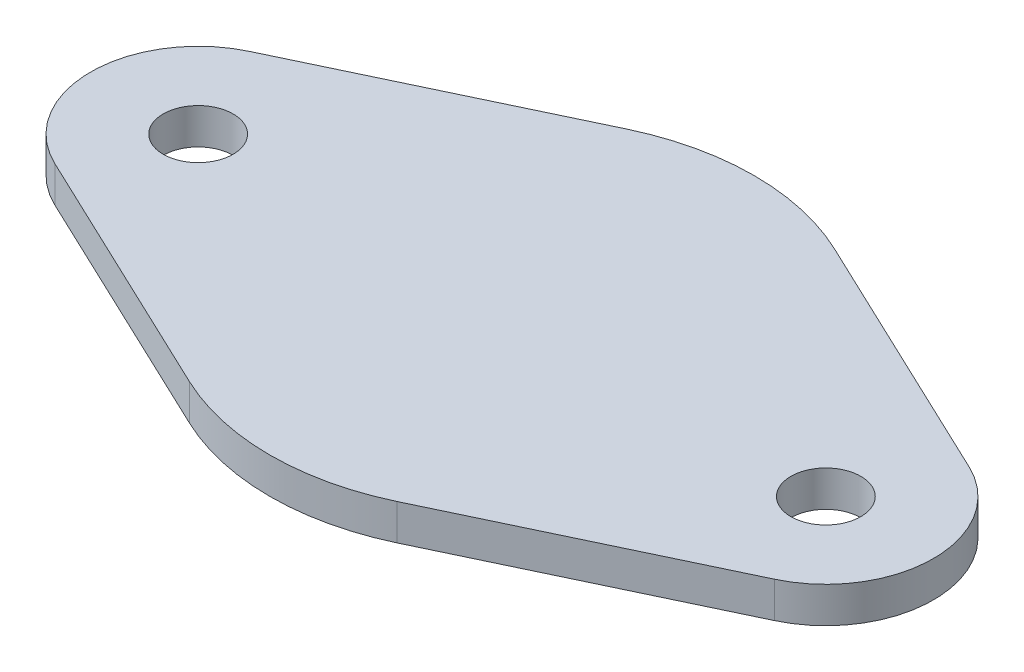
ISO-10303-21;
HEADER;
FILE_DESCRIPTION(('STEP AP214'),'2;1');
FILE_NAME('part.step','',(''),(''),'','','');
FILE_SCHEMA(('AUTOMOTIVE_DESIGN { 1 0 10303 214 1 1 1 1 }'));
ENDSEC;
DATA;
#1=APPLICATION_CONTEXT('core data for automotive mechanical design processes');
#2=APPLICATION_PROTOCOL_DEFINITION('international standard','automotive_design',2000,#1);
#3=PRODUCT_CONTEXT('',#1,'mechanical');
#4=PRODUCT('Part','Part','',(#3));
#5=PRODUCT_RELATED_PRODUCT_CATEGORY('part','',(#4));
#6=PRODUCT_DEFINITION_FORMATION('','',#4);
#7=PRODUCT_DEFINITION_CONTEXT('part definition',#1,'design');
#8=PRODUCT_DEFINITION('design','',#6,#7);
#9=PRODUCT_DEFINITION_SHAPE('','',#8);
#10=(LENGTH_UNIT() NAMED_UNIT(*) SI_UNIT(.MILLI.,.METRE.));
#11=(NAMED_UNIT(*) PLANE_ANGLE_UNIT() SI_UNIT($,.RADIAN.));
#12=(NAMED_UNIT(*) SI_UNIT($,.STERADIAN.) SOLID_ANGLE_UNIT());
#13=UNCERTAINTY_MEASURE_WITH_UNIT(LENGTH_MEASURE(1.E-05),#10,'distance_accuracy_value','');
#14=(GEOMETRIC_REPRESENTATION_CONTEXT(3) GLOBAL_UNCERTAINTY_ASSIGNED_CONTEXT((#13)) GLOBAL_UNIT_ASSIGNED_CONTEXT((#10,
#11,#12)) REPRESENTATION_CONTEXT('',''));
#15=CARTESIAN_POINT('',(0.,0.,0.));
#16=DIRECTION('',(0.,0.,1.));
#17=DIRECTION('',(1.,0.,0.));
#18=AXIS2_PLACEMENT_3D('',#15,#16,#17);
#19=CARTESIAN_POINT('',(-5.78571428571428,2.,12.1973566892209));
#20=DIRECTION('',(0.428571428571428,0.,-0.903507902905251));
#21=DIRECTION('',(-0.903507902905251,0.,-0.428571428571428));
#22=AXIS2_PLACEMENT_3D('',#19,#20,#21);
#23=PLANE('',#22);
#24=DIRECTION('',(0.903507902905251,0.,0.428571428571428));
#25=VECTOR('',#24,1.);
#26=CARTESIAN_POINT('',(-5.78571428571428,0.,12.1973566892209));
#27=LINE('',#26,#25);
#28=CARTESIAN_POINT('',(-20.0714285714286,0.,5.42104741743151));
#29=VERTEX_POINT('',#28);
#30=CARTESIAN_POINT('',(-5.78571428571428,0.,12.1973566892209));
#31=VERTEX_POINT('',#30);
#32=EDGE_CURVE('E146',#29,#31,#27,.T.);
#33=ORIENTED_EDGE('',*,*,#32,.T.);
#34=DIRECTION('',(0.,-1.,0.));
#35=VECTOR('',#34,1.);
#36=CARTESIAN_POINT('',(-5.78571428571428,2.,12.1973566892209));
#37=LINE('',#36,#35);
#38=CARTESIAN_POINT('',(-5.78571428571428,2.,12.1973566892209));
#39=VERTEX_POINT('',#38);
#40=EDGE_CURVE('E11',#39,#31,#37,.T.);
#41=ORIENTED_EDGE('',*,*,#40,.F.);
#42=DIRECTION('',(0.903507902905251,0.,0.428571428571428));
#43=VECTOR('',#42,1.);
#44=CARTESIAN_POINT('',(-5.78571428571428,2.,12.1973566892209));
#45=LINE('',#44,#43);
#46=CARTESIAN_POINT('',(-20.0714285714286,2.,5.42104741743151));
#47=VERTEX_POINT('',#46);
#48=EDGE_CURVE('E190',#47,#39,#45,.T.);
#49=ORIENTED_EDGE('',*,*,#48,.F.);
#50=DIRECTION('',(0.,-1.,0.));
#51=VECTOR('',#50,1.);
#52=CARTESIAN_POINT('',(-20.0714285714286,2.,5.42104741743151));
#53=LINE('',#52,#51);
#54=EDGE_CURVE('E136',#47,#29,#53,.T.);
#55=ORIENTED_EDGE('',*,*,#54,.T.);
#56=EDGE_LOOP('',(#33,#41,#49,#55));
#57=FACE_BOUND('',#56,.T.);
#58=ADVANCED_FACE('F43',(#57),#23,.F.);
#59=CARTESIAN_POINT('',(0.,2.,0.));
#60=DIRECTION('',(0.,-1.,0.));
#61=DIRECTION('',(0.,0.,-1.));
#62=AXIS2_PLACEMENT_3D('',#59,#60,#61);
#63=CYLINDRICAL_SURFACE('',#62,13.5);
#64=CARTESIAN_POINT('',(0.,0.,0.));
#65=DIRECTION('',(0.,1.,0.));
#66=DIRECTION('',(0.,0.,1.));
#67=AXIS2_PLACEMENT_3D('',#64,#65,#66);
#68=CIRCLE('',#67,13.5);
#69=CARTESIAN_POINT('',(5.78571428571428,0.,12.1973566892209));
#70=VERTEX_POINT('',#69);
#71=EDGE_CURVE('E149',#31,#70,#68,.T.);
#72=ORIENTED_EDGE('',*,*,#71,.T.);
#73=DIRECTION('',(0.,-1.,0.));
#74=VECTOR('',#73,1.);
#75=CARTESIAN_POINT('',(5.78571428571428,2.,12.1973566892209));
#76=LINE('',#75,#74);
#77=CARTESIAN_POINT('',(5.78571428571428,2.,12.1973566892209));
#78=VERTEX_POINT('',#77);
#79=EDGE_CURVE('E52',#78,#70,#76,.T.);
#80=ORIENTED_EDGE('',*,*,#79,.F.);
#81=CARTESIAN_POINT('',(0.,2.,0.));
#82=DIRECTION('',(0.,1.,0.));
#83=DIRECTION('',(0.,0.,1.));
#84=AXIS2_PLACEMENT_3D('',#81,#82,#83);
#85=CIRCLE('',#84,13.5);
#86=EDGE_CURVE('E99',#39,#78,#85,.T.);
#87=ORIENTED_EDGE('',*,*,#86,.F.);
#88=ORIENTED_EDGE('',*,*,#40,.T.);
#89=EDGE_LOOP('',(#72,#80,#87,#88));
#90=FACE_BOUND('',#89,.T.);
#91=ADVANCED_FACE('F177',(#90),#63,.T.);
#92=CARTESIAN_POINT('',(5.78571428571427,2.,12.1973566892209));
#93=DIRECTION('',(0.428571428571428,0.,0.903507902905252));
#94=DIRECTION('',(0.903507902905252,0.,-0.428571428571428));
#95=AXIS2_PLACEMENT_3D('',#92,#93,#94);
#96=PLANE('',#95);
#97=DIRECTION('',(-0.903507902905252,0.,0.428571428571428));
#98=VECTOR('',#97,1.);
#99=CARTESIAN_POINT('',(5.78571428571427,0.,12.1973566892209));
#100=LINE('',#99,#98);
#101=CARTESIAN_POINT('',(20.0714285714286,0.,5.42104741743151));
#102=VERTEX_POINT('',#101);
#103=EDGE_CURVE('E152',#102,#70,#100,.T.);
#104=ORIENTED_EDGE('',*,*,#103,.F.);
#105=DIRECTION('',(0.,-1.,0.));
#106=VECTOR('',#105,1.);
#107=CARTESIAN_POINT('',(20.0714285714286,2.,5.42104741743151));
#108=LINE('',#107,#106);
#109=CARTESIAN_POINT('',(20.0714285714286,2.,5.42104741743151));
#110=VERTEX_POINT('',#109);
#111=EDGE_CURVE('E170',#110,#102,#108,.T.);
#112=ORIENTED_EDGE('',*,*,#111,.F.);
#113=DIRECTION('',(-0.903507902905252,0.,0.428571428571428));
#114=VECTOR('',#113,1.);
#115=CARTESIAN_POINT('',(5.78571428571427,2.,12.1973566892209));
#116=LINE('',#115,#114);
#117=EDGE_CURVE('E176',#110,#78,#116,.T.);
#118=ORIENTED_EDGE('',*,*,#117,.T.);
#119=ORIENTED_EDGE('',*,*,#79,.T.);
#120=EDGE_LOOP('',(#104,#112,#118,#119));
#121=FACE_BOUND('',#120,.T.);
#122=ADVANCED_FACE('F174',(#121),#96,.T.);
#123=CARTESIAN_POINT('',(17.5,2.,0.));
#124=DIRECTION('',(0.,-1.,0.));
#125=DIRECTION('',(0.,0.,-1.));
#126=AXIS2_PLACEMENT_3D('',#123,#124,#125);
#127=CYLINDRICAL_SURFACE('',#126,6.);
#128=CARTESIAN_POINT('',(17.5,0.,0.));
#129=DIRECTION('',(0.,1.,0.));
#130=DIRECTION('',(0.,0.,1.));
#131=AXIS2_PLACEMENT_3D('',#128,#129,#130);
#132=CIRCLE('',#131,6.);
#133=CARTESIAN_POINT('',(20.0714285714286,0.,-5.42104741743151));
#134=VERTEX_POINT('',#133);
#135=EDGE_CURVE('E155',#134,#102,#132,.F.);
#136=ORIENTED_EDGE('',*,*,#135,.F.);
#137=DIRECTION('',(0.,-1.,0.));
#138=VECTOR('',#137,1.);
#139=CARTESIAN_POINT('',(20.0714285714286,2.,-5.42104741743151));
#140=LINE('',#139,#138);
#141=CARTESIAN_POINT('',(20.0714285714286,2.,-5.42104741743151));
#142=VERTEX_POINT('',#141);
#143=EDGE_CURVE('E168',#142,#134,#140,.T.);
#144=ORIENTED_EDGE('',*,*,#143,.F.);
#145=CARTESIAN_POINT('',(17.5,2.,0.));
#146=DIRECTION('',(0.,1.,0.));
#147=DIRECTION('',(0.,0.,1.));
#148=AXIS2_PLACEMENT_3D('',#145,#146,#147);
#149=CIRCLE('',#148,6.);
#150=EDGE_CURVE('E187',#142,#110,#149,.F.);
#151=ORIENTED_EDGE('',*,*,#150,.T.);
#152=ORIENTED_EDGE('',*,*,#111,.T.);
#153=EDGE_LOOP('',(#136,#144,#151,#152));
#154=FACE_BOUND('',#153,.T.);
#155=ADVANCED_FACE('F185',(#154),#127,.T.);
#156=CARTESIAN_POINT('',(5.78571428571427,2.,-12.1973566892209));
#157=DIRECTION('',(-0.428571428571428,0.,0.903507902905252));
#158=DIRECTION('',(0.903507902905252,0.,0.428571428571428));
#159=AXIS2_PLACEMENT_3D('',#156,#157,#158);
#160=PLANE('',#159);
#161=DIRECTION('',(-0.903507902905252,0.,-0.428571428571428));
#162=VECTOR('',#161,1.);
#163=CARTESIAN_POINT('',(5.78571428571427,0.,-12.1973566892209));
#164=LINE('',#163,#162);
#165=CARTESIAN_POINT('',(5.78571428571428,0.,-12.1973566892209));
#166=VERTEX_POINT('',#165);
#167=EDGE_CURVE('E158',#134,#166,#164,.T.);
#168=ORIENTED_EDGE('',*,*,#167,.T.);
#169=DIRECTION('',(0.,-1.,0.));
#170=VECTOR('',#169,1.);
#171=CARTESIAN_POINT('',(5.78571428571428,2.,-12.1973566892209));
#172=LINE('',#171,#170);
#173=CARTESIAN_POINT('',(5.78571428571428,2.,-12.1973566892209));
#174=VERTEX_POINT('',#173);
#175=EDGE_CURVE('E132',#174,#166,#172,.T.);
#176=ORIENTED_EDGE('',*,*,#175,.F.);
#177=DIRECTION('',(-0.903507902905252,0.,-0.428571428571428));
#178=VECTOR('',#177,1.);
#179=CARTESIAN_POINT('',(5.78571428571427,2.,-12.1973566892209));
#180=LINE('',#179,#178);
#181=EDGE_CURVE('E119',#142,#174,#180,.T.);
#182=ORIENTED_EDGE('',*,*,#181,.F.);
#183=ORIENTED_EDGE('',*,*,#143,.T.);
#184=EDGE_LOOP('',(#168,#176,#182,#183));
#185=FACE_BOUND('',#184,.T.);
#186=ADVANCED_FACE('F231',(#185),#160,.F.);
#187=CARTESIAN_POINT('',(0.,2.,0.));
#188=DIRECTION('',(0.,-1.,0.));
#189=DIRECTION('',(0.,0.,-1.));
#190=AXIS2_PLACEMENT_3D('',#187,#188,#189);
#191=CYLINDRICAL_SURFACE('',#190,13.5);
#192=CARTESIAN_POINT('',(0.,0.,0.));
#193=DIRECTION('',(0.,1.,0.));
#194=DIRECTION('',(0.,0.,1.));
#195=AXIS2_PLACEMENT_3D('',#192,#193,#194);
#196=CIRCLE('',#195,13.5);
#197=CARTESIAN_POINT('',(-5.78571428571428,0.,-12.1973566892209));
#198=VERTEX_POINT('',#197);
#199=EDGE_CURVE('E128',#166,#198,#196,.T.);
#200=ORIENTED_EDGE('',*,*,#199,.T.);
#201=DIRECTION('',(0.,-1.,0.));
#202=VECTOR('',#201,1.);
#203=CARTESIAN_POINT('',(-5.78571428571428,2.,-12.1973566892209));
#204=LINE('',#203,#202);
#205=CARTESIAN_POINT('',(-5.78571428571428,2.,-12.1973566892209));
#206=VERTEX_POINT('',#205);
#207=EDGE_CURVE('E125',#206,#198,#204,.T.);
#208=ORIENTED_EDGE('',*,*,#207,.F.);
#209=CARTESIAN_POINT('',(0.,2.,0.));
#210=DIRECTION('',(0.,1.,0.));
#211=DIRECTION('',(0.,0.,1.));
#212=AXIS2_PLACEMENT_3D('',#209,#210,#211);
#213=CIRCLE('',#212,13.5);
#214=EDGE_CURVE('E112',#174,#206,#213,.T.);
#215=ORIENTED_EDGE('',*,*,#214,.F.);
#216=ORIENTED_EDGE('',*,*,#175,.T.);
#217=EDGE_LOOP('',(#200,#208,#215,#216));
#218=FACE_BOUND('',#217,.T.);
#219=ADVANCED_FACE('F126',(#218),#191,.T.);
#220=CARTESIAN_POINT('',(-5.78571428571428,2.,-12.1973566892209));
#221=DIRECTION('',(-0.428571428571428,0.,-0.903507902905251));
#222=DIRECTION('',(-0.903507902905251,0.,0.428571428571428));
#223=AXIS2_PLACEMENT_3D('',#220,#221,#222);
#224=PLANE('',#223);
#225=DIRECTION('',(0.903507902905251,0.,-0.428571428571428));
#226=VECTOR('',#225,1.);
#227=CARTESIAN_POINT('',(-5.78571428571428,0.,-12.1973566892209));
#228=LINE('',#227,#226);
#229=CARTESIAN_POINT('',(-20.0714285714286,0.,-5.42104741743151));
#230=VERTEX_POINT('',#229);
#231=EDGE_CURVE('E161',#230,#198,#228,.T.);
#232=ORIENTED_EDGE('',*,*,#231,.F.);
#233=DIRECTION('',(0.,-1.,0.));
#234=VECTOR('',#233,1.);
#235=CARTESIAN_POINT('',(-20.0714285714286,2.,-5.42104741743151));
#236=LINE('',#235,#234);
#237=CARTESIAN_POINT('',(-20.0714285714286,2.,-5.42104741743151));
#238=VERTEX_POINT('',#237);
#239=EDGE_CURVE('E88',#238,#230,#236,.T.);
#240=ORIENTED_EDGE('',*,*,#239,.F.);
#241=DIRECTION('',(0.903507902905251,0.,-0.428571428571428));
#242=VECTOR('',#241,1.);
#243=CARTESIAN_POINT('',(-5.78571428571428,2.,-12.1973566892209));
#244=LINE('',#243,#242);
#245=EDGE_CURVE('E116',#238,#206,#244,.T.);
#246=ORIENTED_EDGE('',*,*,#245,.T.);
#247=ORIENTED_EDGE('',*,*,#207,.T.);
#248=EDGE_LOOP('',(#232,#240,#246,#247));
#249=FACE_BOUND('',#248,.T.);
#250=ADVANCED_FACE('F134',(#249),#224,.T.);
#251=CARTESIAN_POINT('',(-17.5,2.,0.));
#252=DIRECTION('',(0.,-1.,0.));
#253=DIRECTION('',(0.,0.,-1.));
#254=AXIS2_PLACEMENT_3D('',#251,#252,#253);
#255=CYLINDRICAL_SURFACE('',#254,1.95);
#256=CARTESIAN_POINT('',(-17.5,2.,0.));
#257=DIRECTION('',(0.,1.,0.));
#258=DIRECTION('',(0.,0.,1.));
#259=AXIS2_PLACEMENT_3D('',#256,#257,#258);
#260=CIRCLE('',#259,1.95);
#261=CARTESIAN_POINT('',(-17.5,2.,1.95));
#262=VERTEX_POINT('',#261);
#263=EDGE_CURVE('E194',#262,#262,#260,.T.);
#264=ORIENTED_EDGE('',*,*,#263,.T.);
#265=EDGE_LOOP('',(#264));
#266=FACE_BOUND('',#265,.T.);
#267=CARTESIAN_POINT('',(-17.5,0.,0.));
#268=DIRECTION('',(0.,1.,0.));
#269=DIRECTION('',(0.,0.,1.));
#270=AXIS2_PLACEMENT_3D('',#267,#268,#269);
#271=CIRCLE('',#270,1.95);
#272=CARTESIAN_POINT('',(-17.5,0.,1.95));
#273=VERTEX_POINT('',#272);
#274=EDGE_CURVE('E143',#273,#273,#271,.T.);
#275=ORIENTED_EDGE('',*,*,#274,.F.);
#276=EDGE_LOOP('',(#275));
#277=FACE_BOUND('',#276,.T.);
#278=ADVANCED_FACE('F205',(#266,#277),#255,.F.);
#279=CARTESIAN_POINT('',(17.5,2.,0.));
#280=DIRECTION('',(0.,-1.,0.));
#281=DIRECTION('',(0.,0.,-1.));
#282=AXIS2_PLACEMENT_3D('',#279,#280,#281);
#283=CYLINDRICAL_SURFACE('',#282,1.95);
#284=CARTESIAN_POINT('',(17.5,2.,0.));
#285=DIRECTION('',(0.,1.,0.));
#286=DIRECTION('',(0.,0.,1.));
#287=AXIS2_PLACEMENT_3D('',#284,#285,#286);
#288=CIRCLE('',#287,1.95);
#289=CARTESIAN_POINT('',(17.5,2.,1.94999999999999));
#290=VERTEX_POINT('',#289);
#291=EDGE_CURVE('E164',#290,#290,#288,.F.);
#292=ORIENTED_EDGE('',*,*,#291,.F.);
#293=EDGE_LOOP('',(#292));
#294=FACE_BOUND('',#293,.T.);
#295=CARTESIAN_POINT('',(17.5,0.,0.));
#296=DIRECTION('',(0.,1.,0.));
#297=DIRECTION('',(0.,0.,1.));
#298=AXIS2_PLACEMENT_3D('',#295,#296,#297);
#299=CIRCLE('',#298,1.95);
#300=CARTESIAN_POINT('',(17.5,0.,1.94999999999999));
#301=VERTEX_POINT('',#300);
#302=EDGE_CURVE('E140',#301,#301,#299,.F.);
#303=ORIENTED_EDGE('',*,*,#302,.T.);
#304=EDGE_LOOP('',(#303));
#305=FACE_BOUND('',#304,.T.);
#306=ADVANCED_FACE('F45',(#294,#305),#283,.F.);
#307=CARTESIAN_POINT('',(-17.5,2.,0.));
#308=DIRECTION('',(0.,-1.,0.));
#309=DIRECTION('',(0.,0.,-1.));
#310=AXIS2_PLACEMENT_3D('',#307,#308,#309);
#311=CYLINDRICAL_SURFACE('',#310,6.);
#312=CARTESIAN_POINT('',(-17.5,0.,0.));
#313=DIRECTION('',(0.,1.,0.));
#314=DIRECTION('',(0.,0.,1.));
#315=AXIS2_PLACEMENT_3D('',#312,#313,#314);
#316=CIRCLE('',#315,6.);
#317=EDGE_CURVE('E91',#230,#29,#316,.T.);
#318=ORIENTED_EDGE('',*,*,#317,.T.);
#319=ORIENTED_EDGE('',*,*,#54,.F.);
#320=CARTESIAN_POINT('',(-17.5,2.,0.));
#321=DIRECTION('',(0.,1.,0.));
#322=DIRECTION('',(0.,0.,1.));
#323=AXIS2_PLACEMENT_3D('',#320,#321,#322);
#324=CIRCLE('',#323,6.);
#325=EDGE_CURVE('E60',#238,#47,#324,.T.);
#326=ORIENTED_EDGE('',*,*,#325,.F.);
#327=ORIENTED_EDGE('',*,*,#239,.T.);
#328=EDGE_LOOP('',(#318,#319,#326,#327));
#329=FACE_BOUND('',#328,.T.);
#330=ADVANCED_FACE('F204',(#329),#311,.T.);
#331=CARTESIAN_POINT('',(0.,2.,0.));
#332=DIRECTION('',(0.,1.,0.));
#333=DIRECTION('',(0.,0.,1.));
#334=AXIS2_PLACEMENT_3D('',#331,#332,#333);
#335=PLANE('',#334);
#336=ORIENTED_EDGE('',*,*,#291,.T.);
#337=EDGE_LOOP('',(#336));
#338=FACE_BOUND('',#337,.T.);
#339=ORIENTED_EDGE('',*,*,#263,.F.);
#340=EDGE_LOOP('',(#339));
#341=FACE_BOUND('',#340,.T.);
#342=ORIENTED_EDGE('',*,*,#48,.T.);
#343=ORIENTED_EDGE('',*,*,#86,.T.);
#344=ORIENTED_EDGE('',*,*,#117,.F.);
#345=ORIENTED_EDGE('',*,*,#150,.F.);
#346=ORIENTED_EDGE('',*,*,#181,.T.);
#347=ORIENTED_EDGE('',*,*,#214,.T.);
#348=ORIENTED_EDGE('',*,*,#245,.F.);
#349=ORIENTED_EDGE('',*,*,#325,.T.);
#350=EDGE_LOOP('',(#342,#343,#344,#345,#346,#347,#348,#349));
#351=FACE_BOUND('',#350,.T.);
#352=ADVANCED_FACE('F114',(#338,#341,#351),#335,.T.);
#353=CARTESIAN_POINT('',(0.,0.,0.));
#354=DIRECTION('',(0.,1.,0.));
#355=DIRECTION('',(0.,0.,1.));
#356=AXIS2_PLACEMENT_3D('',#353,#354,#355);
#357=PLANE('',#356);
#358=ORIENTED_EDGE('',*,*,#302,.F.);
#359=EDGE_LOOP('',(#358));
#360=FACE_BOUND('',#359,.T.);
#361=ORIENTED_EDGE('',*,*,#274,.T.);
#362=EDGE_LOOP('',(#361));
#363=FACE_BOUND('',#362,.T.);
#364=ORIENTED_EDGE('',*,*,#32,.F.);
#365=ORIENTED_EDGE('',*,*,#317,.F.);
#366=ORIENTED_EDGE('',*,*,#231,.T.);
#367=ORIENTED_EDGE('',*,*,#199,.F.);
#368=ORIENTED_EDGE('',*,*,#167,.F.);
#369=ORIENTED_EDGE('',*,*,#135,.T.);
#370=ORIENTED_EDGE('',*,*,#103,.T.);
#371=ORIENTED_EDGE('',*,*,#71,.F.);
#372=EDGE_LOOP('',(#364,#365,#366,#367,#368,#369,#370,#371));
#373=FACE_BOUND('',#372,.T.);
#374=ADVANCED_FACE('F181',(#360,#363,#373),#357,.F.);
#375=CLOSED_SHELL('',(#58,#91,#122,#155,#186,#219,#250,#278,#306,#330,#352,#374));
#376=MANIFOLD_SOLID_BREP('B2',#375);
#377=ADVANCED_BREP_SHAPE_REPRESENTATION('',(#18,#376),#14);
#378=SHAPE_DEFINITION_REPRESENTATION(#9,#377);
ENDSEC;
END-ISO-10303-21;
